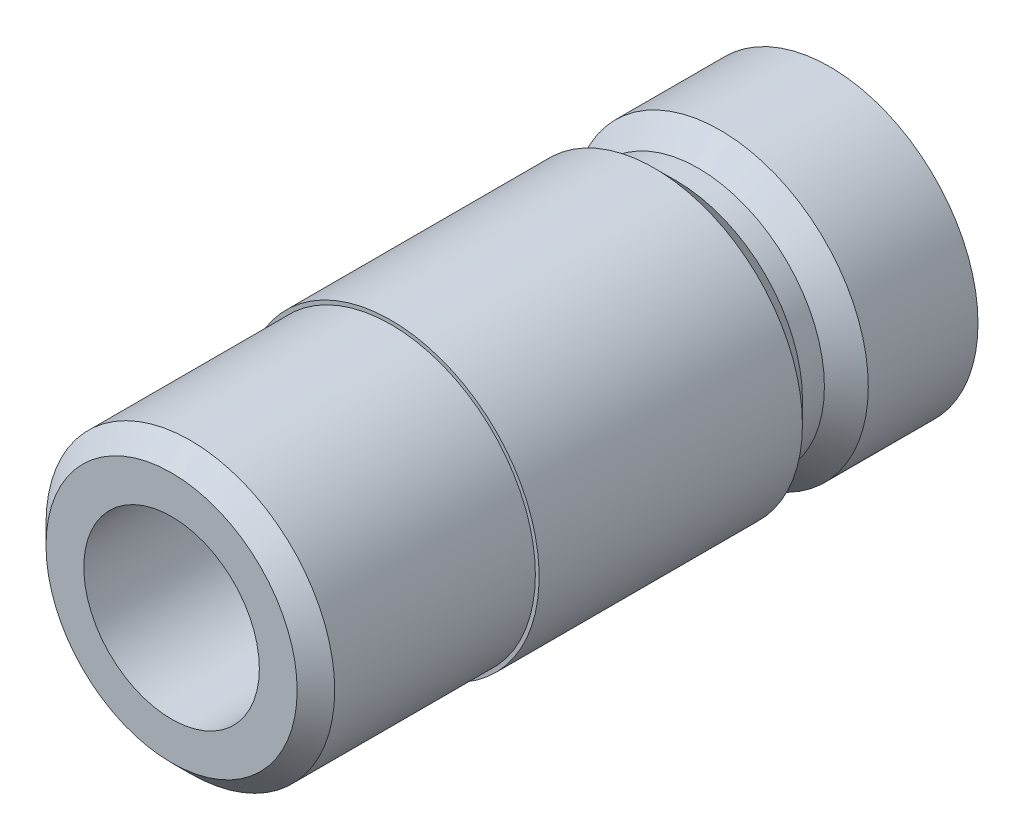
ISO-10303-21;
HEADER;
FILE_DESCRIPTION(('STEP AP214'),'2;1');
FILE_NAME('part.step','',(''),(''),'','','');
FILE_SCHEMA(('AUTOMOTIVE_DESIGN { 1 0 10303 214 1 1 1 1 }'));
ENDSEC;
DATA;
#1=APPLICATION_CONTEXT('core data for automotive mechanical design processes');
#2=APPLICATION_PROTOCOL_DEFINITION('international standard','automotive_design',2000,#1);
#3=PRODUCT_CONTEXT('',#1,'mechanical');
#4=PRODUCT('Part','Part','',(#3));
#5=PRODUCT_RELATED_PRODUCT_CATEGORY('part','',(#4));
#6=PRODUCT_DEFINITION_FORMATION('','',#4);
#7=PRODUCT_DEFINITION_CONTEXT('part definition',#1,'design');
#8=PRODUCT_DEFINITION('design','',#6,#7);
#9=PRODUCT_DEFINITION_SHAPE('','',#8);
#10=(LENGTH_UNIT() NAMED_UNIT(*) SI_UNIT(.MILLI.,.METRE.));
#11=(NAMED_UNIT(*) PLANE_ANGLE_UNIT() SI_UNIT($,.RADIAN.));
#12=(NAMED_UNIT(*) SI_UNIT($,.STERADIAN.) SOLID_ANGLE_UNIT());
#13=UNCERTAINTY_MEASURE_WITH_UNIT(LENGTH_MEASURE(1.E-05),#10,'distance_accuracy_value','');
#14=(GEOMETRIC_REPRESENTATION_CONTEXT(3) GLOBAL_UNCERTAINTY_ASSIGNED_CONTEXT((#13)) GLOBAL_UNIT_ASSIGNED_CONTEXT((#10,
#11,#12)) REPRESENTATION_CONTEXT('',''));
#15=CARTESIAN_POINT('',(0.,0.,0.));
#16=DIRECTION('',(0.,0.,1.));
#17=DIRECTION('',(1.,0.,0.));
#18=AXIS2_PLACEMENT_3D('',#15,#16,#17);
#19=CARTESIAN_POINT('',(0.,0.,30.));
#20=DIRECTION('',(0.,0.,1.));
#21=DIRECTION('',(1.,0.,0.));
#22=AXIS2_PLACEMENT_3D('',#19,#20,#21);
#23=PLANE('',#22);
#24=CARTESIAN_POINT('',(0.,0.,30.));
#25=DIRECTION('',(0.,0.,1.));
#26=DIRECTION('',(1.,0.,0.));
#27=AXIS2_PLACEMENT_3D('',#24,#25,#26);
#28=CIRCLE('',#27,4.);
#29=CARTESIAN_POINT('',(4.,0.,30.));
#30=VERTEX_POINT('',#29);
#31=EDGE_CURVE('E65',#30,#30,#28,.T.);
#32=ORIENTED_EDGE('',*,*,#31,.F.);
#33=EDGE_LOOP('',(#32));
#34=FACE_BOUND('',#33,.T.);
#35=CARTESIAN_POINT('',(0.,0.,30.));
#36=DIRECTION('',(0.,0.,-1.));
#37=DIRECTION('',(-1.,0.,0.));
#38=AXIS2_PLACEMENT_3D('',#35,#36,#37);
#39=CIRCLE('',#38,5.7225);
#40=CARTESIAN_POINT('',(-5.7225,0.,30.));
#41=VERTEX_POINT('',#40);
#42=EDGE_CURVE('E76',#41,#41,#39,.T.);
#43=ORIENTED_EDGE('',*,*,#42,.F.);
#44=EDGE_LOOP('',(#43));
#45=FACE_BOUND('',#44,.T.);
#46=ADVANCED_FACE('F41',(#34,#45),#23,.T.);
#47=CARTESIAN_POINT('',(0.,0.,30.));
#48=DIRECTION('',(0.,0.,-1.));
#49=DIRECTION('',(-1.,0.,0.));
#50=AXIS2_PLACEMENT_3D('',#47,#48,#49);
#51=CYLINDRICAL_SURFACE('',#50,6.75);
#52=CARTESIAN_POINT('',(0.,0.,20.));
#53=DIRECTION('',(0.,0.,-1.));
#54=DIRECTION('',(-1.,0.,0.));
#55=AXIS2_PLACEMENT_3D('',#52,#53,#54);
#56=CIRCLE('',#55,6.75);
#57=CARTESIAN_POINT('',(-6.75,0.,20.));
#58=VERTEX_POINT('',#57);
#59=EDGE_CURVE('E73',#58,#58,#56,.T.);
#60=ORIENTED_EDGE('',*,*,#59,.T.);
#61=EDGE_LOOP('',(#60));
#62=FACE_BOUND('',#61,.T.);
#63=CARTESIAN_POINT('',(0.,0.,8.));
#64=DIRECTION('',(0.,0.,1.));
#65=DIRECTION('',(1.,0.,0.));
#66=AXIS2_PLACEMENT_3D('',#63,#64,#65);
#67=CIRCLE('',#66,6.75);
#68=CARTESIAN_POINT('',(6.75,0.,8.));
#69=VERTEX_POINT('',#68);
#70=EDGE_CURVE('E48',#69,#69,#67,.T.);
#71=ORIENTED_EDGE('',*,*,#70,.T.);
#72=EDGE_LOOP('',(#71));
#73=FACE_BOUND('',#72,.T.);
#74=ADVANCED_FACE('F43',(#62,#73),#51,.T.);
#75=CARTESIAN_POINT('',(0.,0.,8.));
#76=DIRECTION('',(0.,0.,1.));
#77=DIRECTION('',(1.,0.,0.));
#78=AXIS2_PLACEMENT_3D('',#75,#76,#77);
#79=CONICAL_SURFACE('',#78,6.75,0.785398163397448);
#80=CARTESIAN_POINT('',(0.,0.,7.));
#81=DIRECTION('',(0.,0.,1.));
#82=DIRECTION('',(1.,0.,0.));
#83=AXIS2_PLACEMENT_3D('',#80,#81,#82);
#84=CIRCLE('',#83,5.75);
#85=CARTESIAN_POINT('',(5.75,0.,7.));
#86=VERTEX_POINT('',#85);
#87=EDGE_CURVE('E52',#86,#86,#84,.T.);
#88=ORIENTED_EDGE('',*,*,#87,.T.);
#89=EDGE_LOOP('',(#88));
#90=FACE_BOUND('',#89,.T.);
#91=ORIENTED_EDGE('',*,*,#70,.F.);
#92=EDGE_LOOP('',(#91));
#93=FACE_BOUND('',#92,.T.);
#94=ADVANCED_FACE('F99',(#90,#93),#79,.T.);
#95=CARTESIAN_POINT('',(0.,0.,3.92599210622155));
#96=DIRECTION('',(0.,0.,1.));
#97=DIRECTION('',(1.,0.,0.));
#98=AXIS2_PLACEMENT_3D('',#95,#96,#97);
#99=CYLINDRICAL_SURFACE('',#98,5.75);
#100=CARTESIAN_POINT('',(0.,0.,6.));
#101=DIRECTION('',(0.,0.,1.));
#102=DIRECTION('',(1.,0.,0.));
#103=AXIS2_PLACEMENT_3D('',#100,#101,#102);
#104=CIRCLE('',#103,5.75);
#105=CARTESIAN_POINT('',(5.75,0.,6.));
#106=VERTEX_POINT('',#105);
#107=EDGE_CURVE('E56',#106,#106,#104,.T.);
#108=ORIENTED_EDGE('',*,*,#107,.T.);
#109=EDGE_LOOP('',(#108));
#110=FACE_BOUND('',#109,.T.);
#111=ORIENTED_EDGE('',*,*,#87,.F.);
#112=EDGE_LOOP('',(#111));
#113=FACE_BOUND('',#112,.T.);
#114=ADVANCED_FACE('F114',(#110,#113),#99,.T.);
#115=CARTESIAN_POINT('',(0.,0.,6.));
#116=DIRECTION('',(0.,0.,-1.));
#117=DIRECTION('',(-1.,0.,0.));
#118=AXIS2_PLACEMENT_3D('',#115,#116,#117);
#119=CONICAL_SURFACE('',#118,5.75,0.785398163397448);
#120=CARTESIAN_POINT('',(0.,0.,5.));
#121=DIRECTION('',(0.,0.,1.));
#122=DIRECTION('',(1.,0.,0.));
#123=AXIS2_PLACEMENT_3D('',#120,#121,#122);
#124=CIRCLE('',#123,6.75);
#125=CARTESIAN_POINT('',(6.75,0.,5.));
#126=VERTEX_POINT('',#125);
#127=EDGE_CURVE('E61',#126,#126,#124,.T.);
#128=ORIENTED_EDGE('',*,*,#127,.T.);
#129=EDGE_LOOP('',(#128));
#130=FACE_BOUND('',#129,.T.);
#131=ORIENTED_EDGE('',*,*,#107,.F.);
#132=EDGE_LOOP('',(#131));
#133=FACE_BOUND('',#132,.T.);
#134=ADVANCED_FACE('F107',(#130,#133),#119,.T.);
#135=CARTESIAN_POINT('',(0.,0.,0.));
#136=DIRECTION('',(0.,0.,1.));
#137=DIRECTION('',(1.,0.,0.));
#138=AXIS2_PLACEMENT_3D('',#135,#136,#137);
#139=PLANE('',#138);
#140=CARTESIAN_POINT('',(0.,0.,0.));
#141=DIRECTION('',(0.,0.,1.));
#142=DIRECTION('',(1.,0.,0.));
#143=AXIS2_PLACEMENT_3D('',#140,#141,#142);
#144=CIRCLE('',#143,4.);
#145=CARTESIAN_POINT('',(4.,0.,0.));
#146=VERTEX_POINT('',#145);
#147=EDGE_CURVE('E64',#146,#146,#144,.T.);
#148=ORIENTED_EDGE('',*,*,#147,.T.);
#149=EDGE_LOOP('',(#148));
#150=FACE_BOUND('',#149,.T.);
#151=CARTESIAN_POINT('',(0.,0.,0.));
#152=DIRECTION('',(0.,0.,1.));
#153=DIRECTION('',(1.,0.,0.));
#154=AXIS2_PLACEMENT_3D('',#151,#152,#153);
#155=CIRCLE('',#154,6.75);
#156=CARTESIAN_POINT('',(6.75,0.,0.));
#157=VERTEX_POINT('',#156);
#158=EDGE_CURVE('E10',#157,#157,#155,.T.);
#159=ORIENTED_EDGE('',*,*,#158,.F.);
#160=EDGE_LOOP('',(#159));
#161=FACE_BOUND('',#160,.T.);
#162=ADVANCED_FACE('F105',(#150,#161),#139,.F.);
#163=ORIENTED_EDGE('',*,*,#158,.T.);
#164=EDGE_LOOP('',(#163));
#165=FACE_BOUND('',#164,.T.);
#166=ORIENTED_EDGE('',*,*,#127,.F.);
#167=EDGE_LOOP('',(#166));
#168=FACE_BOUND('',#167,.T.);
#169=ADVANCED_FACE('F101',(#165,#168),#51,.T.);
#170=CARTESIAN_POINT('',(0.,0.,0.));
#171=DIRECTION('',(0.,0.,1.));
#172=DIRECTION('',(1.,0.,0.));
#173=AXIS2_PLACEMENT_3D('',#170,#171,#172);
#174=CYLINDRICAL_SURFACE('',#173,4.);
#175=ORIENTED_EDGE('',*,*,#147,.F.);
#176=EDGE_LOOP('',(#175));
#177=FACE_BOUND('',#176,.T.);
#178=ORIENTED_EDGE('',*,*,#31,.T.);
#179=EDGE_LOOP('',(#178));
#180=FACE_BOUND('',#179,.T.);
#181=ADVANCED_FACE('F112',(#177,#180),#174,.F.);
#182=CARTESIAN_POINT('',(0.,0.,30.));
#183=DIRECTION('',(0.,0.,-1.));
#184=DIRECTION('',(-1.,0.,0.));
#185=AXIS2_PLACEMENT_3D('',#182,#183,#184);
#186=CYLINDRICAL_SURFACE('',#185,6.5785);
#187=CARTESIAN_POINT('',(0.,0.,20.));
#188=DIRECTION('',(0.,0.,-1.));
#189=DIRECTION('',(-1.,0.,0.));
#190=AXIS2_PLACEMENT_3D('',#187,#188,#189);
#191=CIRCLE('',#190,6.5785);
#192=CARTESIAN_POINT('',(-6.5785,0.,20.));
#193=VERTEX_POINT('',#192);
#194=EDGE_CURVE('E68',#193,#193,#191,.T.);
#195=ORIENTED_EDGE('',*,*,#194,.F.);
#196=EDGE_LOOP('',(#195));
#197=FACE_BOUND('',#196,.T.);
#198=CARTESIAN_POINT('',(0.,0.,29.144));
#199=DIRECTION('',(0.,0.,-1.));
#200=DIRECTION('',(-1.,0.,0.));
#201=AXIS2_PLACEMENT_3D('',#198,#199,#200);
#202=CIRCLE('',#201,6.5785);
#203=CARTESIAN_POINT('',(-6.5785,0.,29.144));
#204=VERTEX_POINT('',#203);
#205=EDGE_CURVE('E79',#204,#204,#202,.T.);
#206=ORIENTED_EDGE('',*,*,#205,.T.);
#207=EDGE_LOOP('',(#206));
#208=FACE_BOUND('',#207,.T.);
#209=ADVANCED_FACE('F83',(#197,#208),#186,.T.);
#210=CARTESIAN_POINT('',(6.5785,0.,20.));
#211=DIRECTION('',(0.,0.,-1.));
#212=DIRECTION('',(-1.,0.,0.));
#213=AXIS2_PLACEMENT_3D('',#210,#211,#212);
#214=PLANE('',#213);
#215=ORIENTED_EDGE('',*,*,#59,.F.);
#216=EDGE_LOOP('',(#215));
#217=FACE_BOUND('',#216,.T.);
#218=ORIENTED_EDGE('',*,*,#194,.T.);
#219=EDGE_LOOP('',(#218));
#220=FACE_BOUND('',#219,.T.);
#221=ADVANCED_FACE('F88',(#217,#220),#214,.F.);
#222=CARTESIAN_POINT('',(0.,0.,30.));
#223=DIRECTION('',(0.,0.,-1.));
#224=DIRECTION('',(-1.,0.,0.));
#225=AXIS2_PLACEMENT_3D('',#222,#223,#224);
#226=CONICAL_SURFACE('',#225,5.7225,0.785398163397448);
#227=ORIENTED_EDGE('',*,*,#205,.F.);
#228=EDGE_LOOP('',(#227));
#229=FACE_BOUND('',#228,.T.);
#230=ORIENTED_EDGE('',*,*,#42,.T.);
#231=EDGE_LOOP('',(#230));
#232=FACE_BOUND('',#231,.T.);
#233=ADVANCED_FACE('F85',(#229,#232),#226,.T.);
#234=CLOSED_SHELL('',(#46,#74,#94,#114,#134,#162,#169,#181,#209,#221,#233));
#235=MANIFOLD_SOLID_BREP('B2',#234);
#236=ADVANCED_BREP_SHAPE_REPRESENTATION('',(#18,#235),#14);
#237=SHAPE_DEFINITION_REPRESENTATION(#9,#236);
ENDSEC;
END-ISO-10303-21;
